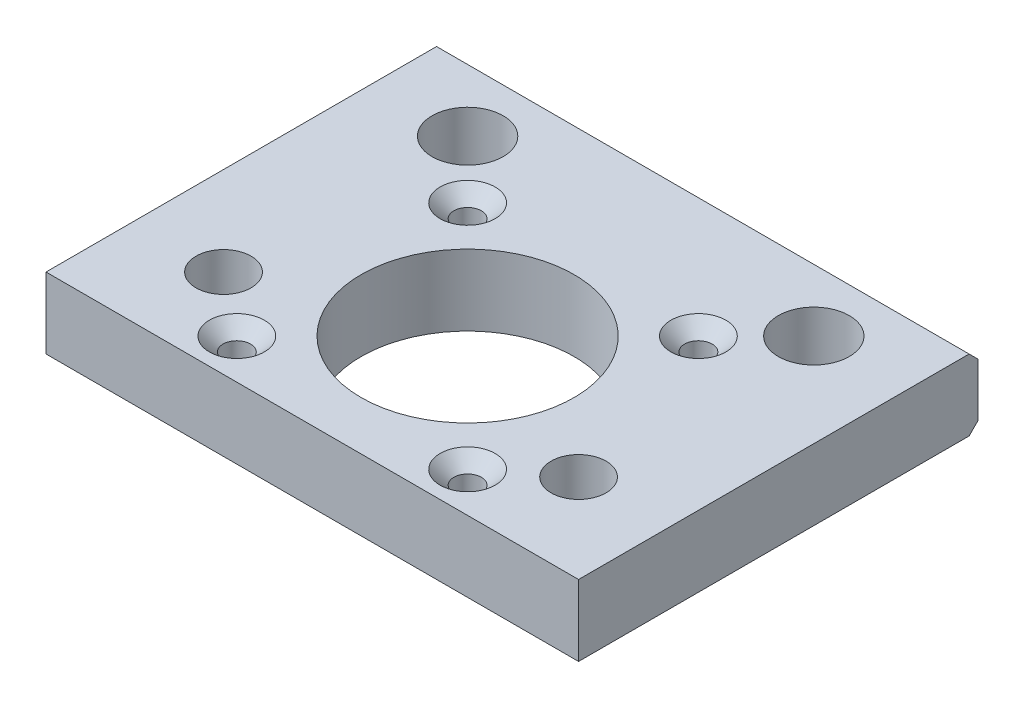
ISO-10303-21;
HEADER;
FILE_DESCRIPTION(('STEP AP214'),'2;1');
FILE_NAME('part.step','',(''),(''),'','','');
FILE_SCHEMA(('AUTOMOTIVE_DESIGN { 1 0 10303 214 1 1 1 1 }'));
ENDSEC;
DATA;
#1=APPLICATION_CONTEXT('core data for automotive mechanical design processes');
#2=APPLICATION_PROTOCOL_DEFINITION('international standard','automotive_design',2000,#1);
#3=PRODUCT_CONTEXT('',#1,'mechanical');
#4=PRODUCT('Part','Part','',(#3));
#5=PRODUCT_RELATED_PRODUCT_CATEGORY('part','',(#4));
#6=PRODUCT_DEFINITION_FORMATION('','',#4);
#7=PRODUCT_DEFINITION_CONTEXT('part definition',#1,'design');
#8=PRODUCT_DEFINITION('design','',#6,#7);
#9=PRODUCT_DEFINITION_SHAPE('','',#8);
#10=(LENGTH_UNIT() NAMED_UNIT(*) SI_UNIT(.MILLI.,.METRE.));
#11=(NAMED_UNIT(*) PLANE_ANGLE_UNIT() SI_UNIT($,.RADIAN.));
#12=(NAMED_UNIT(*) SI_UNIT($,.STERADIAN.) SOLID_ANGLE_UNIT());
#13=UNCERTAINTY_MEASURE_WITH_UNIT(LENGTH_MEASURE(1.E-05),#10,'distance_accuracy_value','');
#14=(GEOMETRIC_REPRESENTATION_CONTEXT(3) GLOBAL_UNCERTAINTY_ASSIGNED_CONTEXT((#13)) GLOBAL_UNIT_ASSIGNED_CONTEXT((#10,
#11,#12)) REPRESENTATION_CONTEXT('',''));
#15=CARTESIAN_POINT('',(0.,0.,0.));
#16=DIRECTION('',(0.,0.,1.));
#17=DIRECTION('',(1.,0.,0.));
#18=AXIS2_PLACEMENT_3D('',#15,#16,#17);
#19=CARTESIAN_POINT('',(0.,8.,0.));
#20=DIRECTION('',(0.,1.,0.));
#21=DIRECTION('',(0.,0.,1.));
#22=AXIS2_PLACEMENT_3D('',#19,#20,#21);
#23=PLANE('',#22);
#24=CARTESIAN_POINT('',(-13.,8.,-8.));
#25=DIRECTION('',(0.,1.,0.));
#26=DIRECTION('',(0.,0.,1.));
#27=AXIS2_PLACEMENT_3D('',#24,#25,#26);
#28=CIRCLE('',#27,3.1);
#29=CARTESIAN_POINT('',(-13.,8.,-4.9));
#30=VERTEX_POINT('',#29);
#31=EDGE_CURVE('E391',#30,#30,#28,.T.);
#32=ORIENTED_EDGE('',*,*,#31,.F.);
#33=EDGE_LOOP('',(#32));
#34=FACE_BOUND('',#33,.T.);
#35=CARTESIAN_POINT('',(-13.,8.,18.));
#36=DIRECTION('',(0.,1.,0.));
#37=DIRECTION('',(0.,0.,1.));
#38=AXIS2_PLACEMENT_3D('',#35,#36,#37);
#39=CIRCLE('',#38,3.1);
#40=CARTESIAN_POINT('',(-13.,8.,21.1));
#41=VERTEX_POINT('',#40);
#42=EDGE_CURVE('E398',#41,#41,#39,.T.);
#43=ORIENTED_EDGE('',*,*,#42,.F.);
#44=EDGE_LOOP('',(#43));
#45=FACE_BOUND('',#44,.T.);
#46=CARTESIAN_POINT('',(13.,8.,18.));
#47=DIRECTION('',(0.,1.,0.));
#48=DIRECTION('',(0.,0.,1.));
#49=AXIS2_PLACEMENT_3D('',#46,#47,#48);
#50=CIRCLE('',#49,3.1);
#51=CARTESIAN_POINT('',(13.,8.,21.1));
#52=VERTEX_POINT('',#51);
#53=EDGE_CURVE('E407',#52,#52,#50,.T.);
#54=ORIENTED_EDGE('',*,*,#53,.F.);
#55=EDGE_LOOP('',(#54));
#56=FACE_BOUND('',#55,.T.);
#57=CARTESIAN_POINT('',(13.,8.,-8.));
#58=DIRECTION('',(0.,1.,0.));
#59=DIRECTION('',(0.,0.,1.));
#60=AXIS2_PLACEMENT_3D('',#57,#58,#59);
#61=CIRCLE('',#60,3.1);
#62=CARTESIAN_POINT('',(13.,8.,-4.9));
#63=VERTEX_POINT('',#62);
#64=EDGE_CURVE('E416',#63,#63,#61,.T.);
#65=ORIENTED_EDGE('',*,*,#64,.F.);
#66=EDGE_LOOP('',(#65));
#67=FACE_BOUND('',#66,.T.);
#68=CARTESIAN_POINT('',(20.,8.,12.5));
#69=DIRECTION('',(0.,-1.,0.));
#70=DIRECTION('',(0.,0.,-1.));
#71=AXIS2_PLACEMENT_3D('',#68,#69,#70);
#72=CIRCLE('',#71,3.1);
#73=CARTESIAN_POINT('',(20.,8.,9.4));
#74=VERTEX_POINT('',#73);
#75=EDGE_CURVE('E431',#74,#74,#72,.T.);
#76=ORIENTED_EDGE('',*,*,#75,.T.);
#77=EDGE_LOOP('',(#76));
#78=FACE_BOUND('',#77,.T.);
#79=CARTESIAN_POINT('',(-20.,8.,12.5));
#80=DIRECTION('',(0.,-1.,0.));
#81=DIRECTION('',(0.,0.,-1.));
#82=AXIS2_PLACEMENT_3D('',#79,#80,#81);
#83=CIRCLE('',#82,3.1);
#84=CARTESIAN_POINT('',(-20.,8.,9.4));
#85=VERTEX_POINT('',#84);
#86=EDGE_CURVE('E440',#85,#85,#83,.T.);
#87=ORIENTED_EDGE('',*,*,#86,.T.);
#88=EDGE_LOOP('',(#87));
#89=FACE_BOUND('',#88,.T.);
#90=CARTESIAN_POINT('',(-19.5,8.,-14.5));
#91=DIRECTION('',(0.,1.,0.));
#92=DIRECTION('',(0.,0.,1.));
#93=AXIS2_PLACEMENT_3D('',#90,#91,#92);
#94=CIRCLE('',#93,4.);
#95=CARTESIAN_POINT('',(-19.5,8.,-10.5));
#96=VERTEX_POINT('',#95);
#97=EDGE_CURVE('E447',#96,#96,#94,.T.);
#98=ORIENTED_EDGE('',*,*,#97,.F.);
#99=EDGE_LOOP('',(#98));
#100=FACE_BOUND('',#99,.T.);
#101=CARTESIAN_POINT('',(19.5,8.,-14.5));
#102=DIRECTION('',(0.,1.,0.));
#103=DIRECTION('',(0.,0.,-1.));
#104=AXIS2_PLACEMENT_3D('',#101,#102,#103);
#105=CIRCLE('',#104,4.);
#106=CARTESIAN_POINT('',(19.5,8.,-18.5));
#107=VERTEX_POINT('',#106);
#108=EDGE_CURVE('E443',#107,#107,#105,.T.);
#109=ORIENTED_EDGE('',*,*,#108,.F.);
#110=EDGE_LOOP('',(#109));
#111=FACE_BOUND('',#110,.T.);
#112=DIRECTION('',(0.,0.,-1.));
#113=VECTOR('',#112,1.);
#114=CARTESIAN_POINT('',(30.,8.,-22.5));
#115=LINE('',#114,#113);
#116=CARTESIAN_POINT('',(30.,8.,22.5));
#117=VERTEX_POINT('',#116);
#118=CARTESIAN_POINT('',(30.,8.,-21.5));
#119=VERTEX_POINT('',#118);
#120=EDGE_CURVE('E110',#117,#119,#115,.T.);
#121=ORIENTED_EDGE('',*,*,#120,.T.);
#122=DIRECTION('',(-1.,0.,0.));
#123=VECTOR('',#122,1.);
#124=CARTESIAN_POINT('',(-30.,8.,-21.5));
#125=LINE('',#124,#123);
#126=CARTESIAN_POINT('',(-30.,8.,-21.5));
#127=VERTEX_POINT('',#126);
#128=EDGE_CURVE('E11',#119,#127,#125,.T.);
#129=ORIENTED_EDGE('',*,*,#128,.T.);
#130=DIRECTION('',(0.,0.,1.));
#131=VECTOR('',#130,1.);
#132=CARTESIAN_POINT('',(-30.,8.,-22.5));
#133=LINE('',#132,#131);
#134=CARTESIAN_POINT('',(-30.,8.,22.5));
#135=VERTEX_POINT('',#134);
#136=EDGE_CURVE('E94',#127,#135,#133,.T.);
#137=ORIENTED_EDGE('',*,*,#136,.T.);
#138=DIRECTION('',(1.,0.,0.));
#139=VECTOR('',#138,1.);
#140=CARTESIAN_POINT('',(-30.,8.,22.5));
#141=LINE('',#140,#139);
#142=EDGE_CURVE('E97',#135,#117,#141,.T.);
#143=ORIENTED_EDGE('',*,*,#142,.T.);
#144=EDGE_LOOP('',(#121,#129,#137,#143));
#145=FACE_BOUND('',#144,.T.);
#146=CARTESIAN_POINT('',(0.,8.,5.));
#147=DIRECTION('',(0.,1.,0.));
#148=DIRECTION('',(0.,0.,1.));
#149=AXIS2_PLACEMENT_3D('',#146,#147,#148);
#150=CIRCLE('',#149,12.);
#151=CARTESIAN_POINT('',(0.,8.,17.));
#152=VERTEX_POINT('',#151);
#153=EDGE_CURVE('E145',#152,#152,#150,.T.);
#154=ORIENTED_EDGE('',*,*,#153,.F.);
#155=EDGE_LOOP('',(#154));
#156=FACE_BOUND('',#155,.T.);
#157=ADVANCED_FACE('F37',(#34,#45,#56,#67,#78,#89,#100,#111,#145,#156),#23,.T.);
#158=CARTESIAN_POINT('',(0.,0.,0.));
#159=DIRECTION('',(0.,1.,0.));
#160=DIRECTION('',(0.,0.,1.));
#161=AXIS2_PLACEMENT_3D('',#158,#159,#160);
#162=PLANE('',#161);
#163=CARTESIAN_POINT('',(-13.,0.,-8.));
#164=DIRECTION('',(0.,1.,0.));
#165=DIRECTION('',(0.,0.,1.));
#166=AXIS2_PLACEMENT_3D('',#163,#164,#165);
#167=CIRCLE('',#166,1.55);
#168=CARTESIAN_POINT('',(-13.,0.,-6.45));
#169=VERTEX_POINT('',#168);
#170=EDGE_CURVE('E393',#169,#169,#167,.T.);
#171=ORIENTED_EDGE('',*,*,#170,.T.);
#172=EDGE_LOOP('',(#171));
#173=FACE_BOUND('',#172,.T.);
#174=CARTESIAN_POINT('',(-13.,0.,18.));
#175=DIRECTION('',(0.,1.,0.));
#176=DIRECTION('',(0.,0.,1.));
#177=AXIS2_PLACEMENT_3D('',#174,#175,#176);
#178=CIRCLE('',#177,1.55);
#179=CARTESIAN_POINT('',(-13.,0.,19.55));
#180=VERTEX_POINT('',#179);
#181=EDGE_CURVE('E404',#180,#180,#178,.T.);
#182=ORIENTED_EDGE('',*,*,#181,.T.);
#183=EDGE_LOOP('',(#182));
#184=FACE_BOUND('',#183,.T.);
#185=CARTESIAN_POINT('',(13.,0.,18.));
#186=DIRECTION('',(0.,1.,0.));
#187=DIRECTION('',(0.,0.,1.));
#188=AXIS2_PLACEMENT_3D('',#185,#186,#187);
#189=CIRCLE('',#188,1.55);
#190=CARTESIAN_POINT('',(13.,0.,19.55));
#191=VERTEX_POINT('',#190);
#192=EDGE_CURVE('E413',#191,#191,#189,.T.);
#193=ORIENTED_EDGE('',*,*,#192,.T.);
#194=EDGE_LOOP('',(#193));
#195=FACE_BOUND('',#194,.T.);
#196=CARTESIAN_POINT('',(13.,0.,-8.));
#197=DIRECTION('',(0.,1.,0.));
#198=DIRECTION('',(0.,0.,1.));
#199=AXIS2_PLACEMENT_3D('',#196,#197,#198);
#200=CIRCLE('',#199,1.55);
#201=CARTESIAN_POINT('',(13.,0.,-6.45));
#202=VERTEX_POINT('',#201);
#203=EDGE_CURVE('E422',#202,#202,#200,.T.);
#204=ORIENTED_EDGE('',*,*,#203,.T.);
#205=EDGE_LOOP('',(#204));
#206=FACE_BOUND('',#205,.T.);
#207=CARTESIAN_POINT('',(20.,0.,12.5));
#208=DIRECTION('',(0.,-1.,0.));
#209=DIRECTION('',(0.,0.,-1.));
#210=AXIS2_PLACEMENT_3D('',#207,#208,#209);
#211=CIRCLE('',#210,6.6);
#212=CARTESIAN_POINT('',(20.,0.,5.9));
#213=VERTEX_POINT('',#212);
#214=EDGE_CURVE('E425',#213,#213,#211,.T.);
#215=ORIENTED_EDGE('',*,*,#214,.F.);
#216=EDGE_LOOP('',(#215));
#217=FACE_BOUND('',#216,.T.);
#218=CARTESIAN_POINT('',(-20.,0.,12.5));
#219=DIRECTION('',(0.,-1.,0.));
#220=DIRECTION('',(0.,0.,-1.));
#221=AXIS2_PLACEMENT_3D('',#218,#219,#220);
#222=CIRCLE('',#221,6.6);
#223=CARTESIAN_POINT('',(-20.,0.,5.9));
#224=VERTEX_POINT('',#223);
#225=EDGE_CURVE('E434',#224,#224,#222,.T.);
#226=ORIENTED_EDGE('',*,*,#225,.F.);
#227=EDGE_LOOP('',(#226));
#228=FACE_BOUND('',#227,.T.);
#229=DIRECTION('',(0.,0.,1.));
#230=VECTOR('',#229,1.);
#231=CARTESIAN_POINT('',(-30.,0.,-22.5));
#232=LINE('',#231,#230);
#233=CARTESIAN_POINT('',(-30.,0.,-21.5));
#234=VERTEX_POINT('',#233);
#235=CARTESIAN_POINT('',(-30.,0.,22.5));
#236=VERTEX_POINT('',#235);
#237=EDGE_CURVE('E114',#234,#236,#232,.T.);
#238=ORIENTED_EDGE('',*,*,#237,.F.);
#239=DIRECTION('',(1.,0.,0.));
#240=VECTOR('',#239,1.);
#241=CARTESIAN_POINT('',(0.,0.,-21.5));
#242=LINE('',#241,#240);
#243=CARTESIAN_POINT('',(30.,0.,-21.5));
#244=VERTEX_POINT('',#243);
#245=EDGE_CURVE('E61',#234,#244,#242,.T.);
#246=ORIENTED_EDGE('',*,*,#245,.T.);
#247=DIRECTION('',(0.,0.,-1.));
#248=VECTOR('',#247,1.);
#249=CARTESIAN_POINT('',(30.,0.,-22.5));
#250=LINE('',#249,#248);
#251=CARTESIAN_POINT('',(30.,0.,22.5));
#252=VERTEX_POINT('',#251);
#253=EDGE_CURVE('E102',#252,#244,#250,.T.);
#254=ORIENTED_EDGE('',*,*,#253,.F.);
#255=DIRECTION('',(1.,0.,0.));
#256=VECTOR('',#255,1.);
#257=CARTESIAN_POINT('',(-30.,0.,22.5));
#258=LINE('',#257,#256);
#259=EDGE_CURVE('E144',#236,#252,#258,.T.);
#260=ORIENTED_EDGE('',*,*,#259,.F.);
#261=EDGE_LOOP('',(#238,#246,#254,#260));
#262=FACE_BOUND('',#261,.T.);
#263=CARTESIAN_POINT('',(0.,0.,5.));
#264=DIRECTION('',(0.,1.,0.));
#265=DIRECTION('',(0.,0.,1.));
#266=AXIS2_PLACEMENT_3D('',#263,#264,#265);
#267=CIRCLE('',#266,12.);
#268=CARTESIAN_POINT('',(0.,0.,17.));
#269=VERTEX_POINT('',#268);
#270=EDGE_CURVE('E149',#269,#269,#267,.T.);
#271=ORIENTED_EDGE('',*,*,#270,.T.);
#272=EDGE_LOOP('',(#271));
#273=FACE_BOUND('',#272,.T.);
#274=ADVANCED_FACE('F142',(#173,#184,#195,#206,#217,#228,#262,#273),#162,.F.);
#275=CARTESIAN_POINT('',(-30.,8.,-22.5));
#276=DIRECTION('',(1.,0.,0.));
#277=DIRECTION('',(0.,0.,-1.));
#278=AXIS2_PLACEMENT_3D('',#275,#276,#277);
#279=PLANE('',#278);
#280=DIRECTION('',(0.,-1.,0.));
#281=VECTOR('',#280,1.);
#282=CARTESIAN_POINT('',(-30.,8.,-22.5));
#283=LINE('',#282,#281);
#284=CARTESIAN_POINT('',(-30.,7.00000000000001,-22.5));
#285=VERTEX_POINT('',#284);
#286=CARTESIAN_POINT('',(-30.,1.,-22.5));
#287=VERTEX_POINT('',#286);
#288=EDGE_CURVE('E140',#285,#287,#283,.T.);
#289=ORIENTED_EDGE('',*,*,#288,.T.);
#290=DIRECTION('',(0.,0.707106781186545,-0.70710678118655));
#291=VECTOR('',#290,1.);
#292=CARTESIAN_POINT('',(-30.,1.,-22.5));
#293=LINE('',#292,#291);
#294=EDGE_CURVE('E128',#287,#234,#293,.F.);
#295=ORIENTED_EDGE('',*,*,#294,.T.);
#296=ORIENTED_EDGE('',*,*,#237,.T.);
#297=DIRECTION('',(0.,-1.,0.));
#298=VECTOR('',#297,1.);
#299=CARTESIAN_POINT('',(-30.,8.,22.5));
#300=LINE('',#299,#298);
#301=EDGE_CURVE('E107',#135,#236,#300,.T.);
#302=ORIENTED_EDGE('',*,*,#301,.F.);
#303=ORIENTED_EDGE('',*,*,#136,.F.);
#304=DIRECTION('',(0.,-0.707106781186548,-0.707106781186548));
#305=VECTOR('',#304,1.);
#306=CARTESIAN_POINT('',(-30.,8.,-21.5));
#307=LINE('',#306,#305);
#308=EDGE_CURVE('E126',#127,#285,#307,.T.);
#309=ORIENTED_EDGE('',*,*,#308,.T.);
#310=EDGE_LOOP('',(#289,#295,#296,#302,#303,#309));
#311=FACE_BOUND('',#310,.T.);
#312=ADVANCED_FACE('F113',(#311),#279,.F.);
#313=CARTESIAN_POINT('',(-30.,8.,22.5));
#314=DIRECTION('',(0.,0.,-1.));
#315=DIRECTION('',(-1.,0.,0.));
#316=AXIS2_PLACEMENT_3D('',#313,#314,#315);
#317=PLANE('',#316);
#318=ORIENTED_EDGE('',*,*,#259,.T.);
#319=DIRECTION('',(0.,-1.,0.));
#320=VECTOR('',#319,1.);
#321=CARTESIAN_POINT('',(30.,8.,22.5));
#322=LINE('',#321,#320);
#323=EDGE_CURVE('E109',#117,#252,#322,.T.);
#324=ORIENTED_EDGE('',*,*,#323,.F.);
#325=ORIENTED_EDGE('',*,*,#142,.F.);
#326=ORIENTED_EDGE('',*,*,#301,.T.);
#327=EDGE_LOOP('',(#318,#324,#325,#326));
#328=FACE_BOUND('',#327,.T.);
#329=ADVANCED_FACE('F106',(#328),#317,.F.);
#330=CARTESIAN_POINT('',(30.,8.,-22.5));
#331=DIRECTION('',(-1.,0.,0.));
#332=DIRECTION('',(0.,0.,1.));
#333=AXIS2_PLACEMENT_3D('',#330,#331,#332);
#334=PLANE('',#333);
#335=ORIENTED_EDGE('',*,*,#253,.T.);
#336=DIRECTION('',(0.,-0.707106781186545,0.70710678118655));
#337=VECTOR('',#336,1.);
#338=CARTESIAN_POINT('',(30.,1.,-22.5));
#339=LINE('',#338,#337);
#340=CARTESIAN_POINT('',(30.,1.,-22.5));
#341=VERTEX_POINT('',#340);
#342=EDGE_CURVE('E46',#244,#341,#339,.F.);
#343=ORIENTED_EDGE('',*,*,#342,.T.);
#344=DIRECTION('',(0.,-1.,0.));
#345=VECTOR('',#344,1.);
#346=CARTESIAN_POINT('',(30.,8.,-22.5));
#347=LINE('',#346,#345);
#348=CARTESIAN_POINT('',(30.,7.00000000000001,-22.5));
#349=VERTEX_POINT('',#348);
#350=EDGE_CURVE('E120',#349,#341,#347,.T.);
#351=ORIENTED_EDGE('',*,*,#350,.F.);
#352=DIRECTION('',(0.,0.707106781186548,0.707106781186548));
#353=VECTOR('',#352,1.);
#354=CARTESIAN_POINT('',(30.,8.,-21.5));
#355=LINE('',#354,#353);
#356=EDGE_CURVE('E53',#349,#119,#355,.T.);
#357=ORIENTED_EDGE('',*,*,#356,.T.);
#358=ORIENTED_EDGE('',*,*,#120,.F.);
#359=ORIENTED_EDGE('',*,*,#323,.T.);
#360=EDGE_LOOP('',(#335,#343,#351,#357,#358,#359));
#361=FACE_BOUND('',#360,.T.);
#362=ADVANCED_FACE('F133',(#361),#334,.F.);
#363=CARTESIAN_POINT('',(-30.,8.,-22.5));
#364=DIRECTION('',(0.,0.,1.));
#365=DIRECTION('',(1.,0.,0.));
#366=AXIS2_PLACEMENT_3D('',#363,#364,#365);
#367=PLANE('',#366);
#368=ORIENTED_EDGE('',*,*,#350,.T.);
#369=DIRECTION('',(-1.,0.,0.));
#370=VECTOR('',#369,1.);
#371=CARTESIAN_POINT('',(-30.,1.,-22.5));
#372=LINE('',#371,#370);
#373=EDGE_CURVE('E118',#341,#287,#372,.T.);
#374=ORIENTED_EDGE('',*,*,#373,.T.);
#375=ORIENTED_EDGE('',*,*,#288,.F.);
#376=DIRECTION('',(1.,0.,0.));
#377=VECTOR('',#376,1.);
#378=CARTESIAN_POINT('',(30.,7.00000000000001,-22.5));
#379=LINE('',#378,#377);
#380=EDGE_CURVE('E116',#285,#349,#379,.T.);
#381=ORIENTED_EDGE('',*,*,#380,.T.);
#382=EDGE_LOOP('',(#368,#374,#375,#381));
#383=FACE_BOUND('',#382,.T.);
#384=ADVANCED_FACE('F137',(#383),#367,.F.);
#385=CARTESIAN_POINT('',(0.,8.,5.));
#386=DIRECTION('',(0.,-1.,0.));
#387=DIRECTION('',(0.,0.,-1.));
#388=AXIS2_PLACEMENT_3D('',#385,#386,#387);
#389=CYLINDRICAL_SURFACE('',#388,12.);
#390=ORIENTED_EDGE('',*,*,#153,.T.);
#391=EDGE_LOOP('',(#390));
#392=FACE_BOUND('',#391,.T.);
#393=ORIENTED_EDGE('',*,*,#270,.F.);
#394=EDGE_LOOP('',(#393));
#395=FACE_BOUND('',#394,.T.);
#396=ADVANCED_FACE('F164',(#392,#395),#389,.F.);
#397=CARTESIAN_POINT('',(-30.,1.,-22.5));
#398=DIRECTION('',(0.,0.70710678118655,0.707106781186545));
#399=DIRECTION('',(-1.,0.,0.));
#400=AXIS2_PLACEMENT_3D('',#397,#398,#399);
#401=PLANE('',#400);
#402=ORIENTED_EDGE('',*,*,#342,.F.);
#403=ORIENTED_EDGE('',*,*,#245,.F.);
#404=ORIENTED_EDGE('',*,*,#294,.F.);
#405=ORIENTED_EDGE('',*,*,#373,.F.);
#406=EDGE_LOOP('',(#402,#403,#404,#405));
#407=FACE_BOUND('',#406,.T.);
#408=ADVANCED_FACE('F141',(#407),#401,.F.);
#409=CARTESIAN_POINT('',(0.,8.,-21.5));
#410=DIRECTION('',(0.,0.707106781186547,-0.707106781186547));
#411=DIRECTION('',(1.,0.,0.));
#412=AXIS2_PLACEMENT_3D('',#409,#410,#411);
#413=PLANE('',#412);
#414=ORIENTED_EDGE('',*,*,#356,.F.);
#415=ORIENTED_EDGE('',*,*,#380,.F.);
#416=ORIENTED_EDGE('',*,*,#308,.F.);
#417=ORIENTED_EDGE('',*,*,#128,.F.);
#418=EDGE_LOOP('',(#414,#415,#416,#417));
#419=FACE_BOUND('',#418,.T.);
#420=ADVANCED_FACE('F40',(#419),#413,.T.);
#421=CARTESIAN_POINT('',(19.5,2.,-14.5));
#422=DIRECTION('',(0.,1.,0.));
#423=DIRECTION('',(0.,0.,1.));
#424=AXIS2_PLACEMENT_3D('',#421,#422,#423);
#425=CYLINDRICAL_SURFACE('',#424,4.);
#426=CARTESIAN_POINT('',(19.5,2.,-14.5));
#427=DIRECTION('',(0.,1.,0.));
#428=DIRECTION('',(0.,0.,-1.));
#429=AXIS2_PLACEMENT_3D('',#426,#427,#428);
#430=CIRCLE('',#429,4.);
#431=CARTESIAN_POINT('',(19.5,2.,-18.5));
#432=VERTEX_POINT('',#431);
#433=EDGE_CURVE('E450',#432,#432,#430,.T.);
#434=ORIENTED_EDGE('',*,*,#433,.F.);
#435=EDGE_LOOP('',(#434));
#436=FACE_BOUND('',#435,.T.);
#437=ORIENTED_EDGE('',*,*,#108,.T.);
#438=EDGE_LOOP('',(#437));
#439=FACE_BOUND('',#438,.T.);
#440=ADVANCED_FACE('F156',(#436,#439),#425,.F.);
#441=CARTESIAN_POINT('',(19.5,2.,-14.5));
#442=DIRECTION('',(0.,-1.,0.));
#443=DIRECTION('',(0.,0.,-1.));
#444=AXIS2_PLACEMENT_3D('',#441,#442,#443);
#445=PLANE('',#444);
#446=ORIENTED_EDGE('',*,*,#433,.T.);
#447=EDGE_LOOP('',(#446));
#448=FACE_BOUND('',#447,.T.);
#449=ADVANCED_FACE('F161',(#448),#445,.F.);
#450=CARTESIAN_POINT('',(-19.5,2.,-14.5));
#451=DIRECTION('',(0.,1.,0.));
#452=DIRECTION('',(0.,0.,1.));
#453=AXIS2_PLACEMENT_3D('',#450,#451,#452);
#454=CYLINDRICAL_SURFACE('',#453,4.);
#455=CARTESIAN_POINT('',(-19.5,2.,-14.5));
#456=DIRECTION('',(0.,1.,0.));
#457=DIRECTION('',(0.,0.,1.));
#458=AXIS2_PLACEMENT_3D('',#455,#456,#457);
#459=CIRCLE('',#458,4.);
#460=CARTESIAN_POINT('',(-19.5,2.,-10.5));
#461=VERTEX_POINT('',#460);
#462=EDGE_CURVE('E444',#461,#461,#459,.T.);
#463=ORIENTED_EDGE('',*,*,#462,.F.);
#464=EDGE_LOOP('',(#463));
#465=FACE_BOUND('',#464,.T.);
#466=ORIENTED_EDGE('',*,*,#97,.T.);
#467=EDGE_LOOP('',(#466));
#468=FACE_BOUND('',#467,.T.);
#469=ADVANCED_FACE('F234',(#465,#468),#454,.F.);
#470=CARTESIAN_POINT('',(-19.5,2.,-14.5));
#471=DIRECTION('',(0.,1.,0.));
#472=DIRECTION('',(0.,0.,1.));
#473=AXIS2_PLACEMENT_3D('',#470,#471,#472);
#474=PLANE('',#473);
#475=ORIENTED_EDGE('',*,*,#462,.T.);
#476=EDGE_LOOP('',(#475));
#477=FACE_BOUND('',#476,.T.);
#478=ADVANCED_FACE('F244',(#477),#474,.T.);
#479=CARTESIAN_POINT('',(-20.,0.,12.5));
#480=DIRECTION('',(0.,-1.,0.));
#481=DIRECTION('',(0.,0.,-1.));
#482=AXIS2_PLACEMENT_3D('',#479,#480,#481);
#483=CYLINDRICAL_SURFACE('',#482,3.1);
#484=ORIENTED_EDGE('',*,*,#86,.F.);
#485=EDGE_LOOP('',(#484));
#486=FACE_BOUND('',#485,.T.);
#487=CARTESIAN_POINT('',(-20.,3.5,12.5));
#488=DIRECTION('',(0.,-1.,0.));
#489=DIRECTION('',(0.,0.,-1.));
#490=AXIS2_PLACEMENT_3D('',#487,#488,#489);
#491=CIRCLE('',#490,3.1);
#492=CARTESIAN_POINT('',(-20.,3.5,9.4));
#493=VERTEX_POINT('',#492);
#494=EDGE_CURVE('E437',#493,#493,#491,.T.);
#495=ORIENTED_EDGE('',*,*,#494,.T.);
#496=EDGE_LOOP('',(#495));
#497=FACE_BOUND('',#496,.T.);
#498=ADVANCED_FACE('F254',(#486,#497),#483,.F.);
#499=CARTESIAN_POINT('',(-20.,0.,12.5));
#500=DIRECTION('',(0.,-1.,0.));
#501=DIRECTION('',(0.,0.,-1.));
#502=AXIS2_PLACEMENT_3D('',#499,#500,#501);
#503=CONICAL_SURFACE('',#502,6.6,0.785398163397449);
#504=ORIENTED_EDGE('',*,*,#494,.F.);
#505=EDGE_LOOP('',(#504));
#506=FACE_BOUND('',#505,.T.);
#507=ORIENTED_EDGE('',*,*,#225,.T.);
#508=EDGE_LOOP('',(#507));
#509=FACE_BOUND('',#508,.T.);
#510=ADVANCED_FACE('F264',(#506,#509),#503,.F.);
#511=CARTESIAN_POINT('',(20.,0.,12.5));
#512=DIRECTION('',(0.,-1.,0.));
#513=DIRECTION('',(0.,0.,-1.));
#514=AXIS2_PLACEMENT_3D('',#511,#512,#513);
#515=CYLINDRICAL_SURFACE('',#514,3.1);
#516=ORIENTED_EDGE('',*,*,#75,.F.);
#517=EDGE_LOOP('',(#516));
#518=FACE_BOUND('',#517,.T.);
#519=CARTESIAN_POINT('',(20.,3.5,12.5));
#520=DIRECTION('',(0.,-1.,0.));
#521=DIRECTION('',(0.,0.,-1.));
#522=AXIS2_PLACEMENT_3D('',#519,#520,#521);
#523=CIRCLE('',#522,3.1);
#524=CARTESIAN_POINT('',(20.,3.5,9.4));
#525=VERTEX_POINT('',#524);
#526=EDGE_CURVE('E428',#525,#525,#523,.T.);
#527=ORIENTED_EDGE('',*,*,#526,.T.);
#528=EDGE_LOOP('',(#527));
#529=FACE_BOUND('',#528,.T.);
#530=ADVANCED_FACE('F274',(#518,#529),#515,.F.);
#531=CARTESIAN_POINT('',(20.,0.,12.5));
#532=DIRECTION('',(0.,-1.,0.));
#533=DIRECTION('',(0.,0.,-1.));
#534=AXIS2_PLACEMENT_3D('',#531,#532,#533);
#535=CONICAL_SURFACE('',#534,6.6,0.785398163397449);
#536=ORIENTED_EDGE('',*,*,#526,.F.);
#537=EDGE_LOOP('',(#536));
#538=FACE_BOUND('',#537,.T.);
#539=ORIENTED_EDGE('',*,*,#214,.T.);
#540=EDGE_LOOP('',(#539));
#541=FACE_BOUND('',#540,.T.);
#542=ADVANCED_FACE('F284',(#538,#541),#535,.F.);
#543=CARTESIAN_POINT('',(13.,8.,-8.));
#544=DIRECTION('',(0.,1.,0.));
#545=DIRECTION('',(0.,0.,1.));
#546=AXIS2_PLACEMENT_3D('',#543,#544,#545);
#547=CYLINDRICAL_SURFACE('',#546,1.55);
#548=ORIENTED_EDGE('',*,*,#203,.F.);
#549=EDGE_LOOP('',(#548));
#550=FACE_BOUND('',#549,.T.);
#551=CARTESIAN_POINT('',(13.,6.45,-8.));
#552=DIRECTION('',(0.,1.,0.));
#553=DIRECTION('',(0.,0.,1.));
#554=AXIS2_PLACEMENT_3D('',#551,#552,#553);
#555=CIRCLE('',#554,1.55);
#556=CARTESIAN_POINT('',(13.,6.45,-6.45));
#557=VERTEX_POINT('',#556);
#558=EDGE_CURVE('E419',#557,#557,#555,.T.);
#559=ORIENTED_EDGE('',*,*,#558,.T.);
#560=EDGE_LOOP('',(#559));
#561=FACE_BOUND('',#560,.T.);
#562=ADVANCED_FACE('F293',(#550,#561),#547,.F.);
#563=CARTESIAN_POINT('',(13.,8.,-8.));
#564=DIRECTION('',(0.,1.,0.));
#565=DIRECTION('',(0.,0.,1.));
#566=AXIS2_PLACEMENT_3D('',#563,#564,#565);
#567=CONICAL_SURFACE('',#566,3.1,0.785398163397448);
#568=ORIENTED_EDGE('',*,*,#558,.F.);
#569=EDGE_LOOP('',(#568));
#570=FACE_BOUND('',#569,.T.);
#571=ORIENTED_EDGE('',*,*,#64,.T.);
#572=EDGE_LOOP('',(#571));
#573=FACE_BOUND('',#572,.T.);
#574=ADVANCED_FACE('F312',(#570,#573),#567,.F.);
#575=CARTESIAN_POINT('',(13.,8.,18.));
#576=DIRECTION('',(0.,1.,0.));
#577=DIRECTION('',(0.,0.,1.));
#578=AXIS2_PLACEMENT_3D('',#575,#576,#577);
#579=CYLINDRICAL_SURFACE('',#578,1.55);
#580=ORIENTED_EDGE('',*,*,#192,.F.);
#581=EDGE_LOOP('',(#580));
#582=FACE_BOUND('',#581,.T.);
#583=CARTESIAN_POINT('',(13.,6.45,18.));
#584=DIRECTION('',(0.,1.,0.));
#585=DIRECTION('',(0.,0.,1.));
#586=AXIS2_PLACEMENT_3D('',#583,#584,#585);
#587=CIRCLE('',#586,1.55);
#588=CARTESIAN_POINT('',(13.,6.45,19.55));
#589=VERTEX_POINT('',#588);
#590=EDGE_CURVE('E410',#589,#589,#587,.T.);
#591=ORIENTED_EDGE('',*,*,#590,.T.);
#592=EDGE_LOOP('',(#591));
#593=FACE_BOUND('',#592,.T.);
#594=ADVANCED_FACE('F322',(#582,#593),#579,.F.);
#595=CARTESIAN_POINT('',(13.,8.,18.));
#596=DIRECTION('',(0.,1.,0.));
#597=DIRECTION('',(0.,0.,1.));
#598=AXIS2_PLACEMENT_3D('',#595,#596,#597);
#599=CONICAL_SURFACE('',#598,3.1,0.785398163397448);
#600=ORIENTED_EDGE('',*,*,#590,.F.);
#601=EDGE_LOOP('',(#600));
#602=FACE_BOUND('',#601,.T.);
#603=ORIENTED_EDGE('',*,*,#53,.T.);
#604=EDGE_LOOP('',(#603));
#605=FACE_BOUND('',#604,.T.);
#606=ADVANCED_FACE('F332',(#602,#605),#599,.F.);
#607=CARTESIAN_POINT('',(-13.,8.,18.));
#608=DIRECTION('',(0.,1.,0.));
#609=DIRECTION('',(0.,0.,1.));
#610=AXIS2_PLACEMENT_3D('',#607,#608,#609);
#611=CYLINDRICAL_SURFACE('',#610,1.55);
#612=ORIENTED_EDGE('',*,*,#181,.F.);
#613=EDGE_LOOP('',(#612));
#614=FACE_BOUND('',#613,.T.);
#615=CARTESIAN_POINT('',(-13.,6.45,18.));
#616=DIRECTION('',(0.,1.,0.));
#617=DIRECTION('',(0.,0.,1.));
#618=AXIS2_PLACEMENT_3D('',#615,#616,#617);
#619=CIRCLE('',#618,1.55);
#620=CARTESIAN_POINT('',(-13.,6.45,19.55));
#621=VERTEX_POINT('',#620);
#622=EDGE_CURVE('E401',#621,#621,#619,.T.);
#623=ORIENTED_EDGE('',*,*,#622,.T.);
#624=EDGE_LOOP('',(#623));
#625=FACE_BOUND('',#624,.T.);
#626=ADVANCED_FACE('F342',(#614,#625),#611,.F.);
#627=CARTESIAN_POINT('',(-13.,8.,18.));
#628=DIRECTION('',(0.,1.,0.));
#629=DIRECTION('',(0.,0.,1.));
#630=AXIS2_PLACEMENT_3D('',#627,#628,#629);
#631=CONICAL_SURFACE('',#630,3.1,0.785398163397448);
#632=ORIENTED_EDGE('',*,*,#622,.F.);
#633=EDGE_LOOP('',(#632));
#634=FACE_BOUND('',#633,.T.);
#635=ORIENTED_EDGE('',*,*,#42,.T.);
#636=EDGE_LOOP('',(#635));
#637=FACE_BOUND('',#636,.T.);
#638=ADVANCED_FACE('F352',(#634,#637),#631,.F.);
#639=CARTESIAN_POINT('',(-13.,8.,-8.));
#640=DIRECTION('',(0.,1.,0.));
#641=DIRECTION('',(0.,0.,1.));
#642=AXIS2_PLACEMENT_3D('',#639,#640,#641);
#643=CYLINDRICAL_SURFACE('',#642,1.55);
#644=ORIENTED_EDGE('',*,*,#170,.F.);
#645=EDGE_LOOP('',(#644));
#646=FACE_BOUND('',#645,.T.);
#647=CARTESIAN_POINT('',(-13.,6.45,-8.));
#648=DIRECTION('',(0.,1.,0.));
#649=DIRECTION('',(0.,0.,1.));
#650=AXIS2_PLACEMENT_3D('',#647,#648,#649);
#651=CIRCLE('',#650,1.55);
#652=CARTESIAN_POINT('',(-13.,6.45,-6.45));
#653=VERTEX_POINT('',#652);
#654=EDGE_CURVE('E389',#653,#653,#651,.T.);
#655=ORIENTED_EDGE('',*,*,#654,.T.);
#656=EDGE_LOOP('',(#655));
#657=FACE_BOUND('',#656,.T.);
#658=ADVANCED_FACE('F362',(#646,#657),#643,.F.);
#659=CARTESIAN_POINT('',(-13.,8.,-8.));
#660=DIRECTION('',(0.,1.,0.));
#661=DIRECTION('',(0.,0.,1.));
#662=AXIS2_PLACEMENT_3D('',#659,#660,#661);
#663=CONICAL_SURFACE('',#662,3.1,0.785398163397448);
#664=ORIENTED_EDGE('',*,*,#654,.F.);
#665=EDGE_LOOP('',(#664));
#666=FACE_BOUND('',#665,.T.);
#667=ORIENTED_EDGE('',*,*,#31,.T.);
#668=EDGE_LOOP('',(#667));
#669=FACE_BOUND('',#668,.T.);
#670=ADVANCED_FACE('F372',(#666,#669),#663,.F.);
#671=CLOSED_SHELL('',(#157,#274,#312,#329,#362,#384,#396,#408,#420,#440,#449,#469,#478,#498,
#510,#530,#542,#562,#574,#594,#606,#626,#638,#658,#670));
#672=MANIFOLD_SOLID_BREP('B2',#671);
#673=ADVANCED_BREP_SHAPE_REPRESENTATION('',(#18,#672),#14);
#674=SHAPE_DEFINITION_REPRESENTATION(#9,#673);
ENDSEC;
END-ISO-10303-21;
